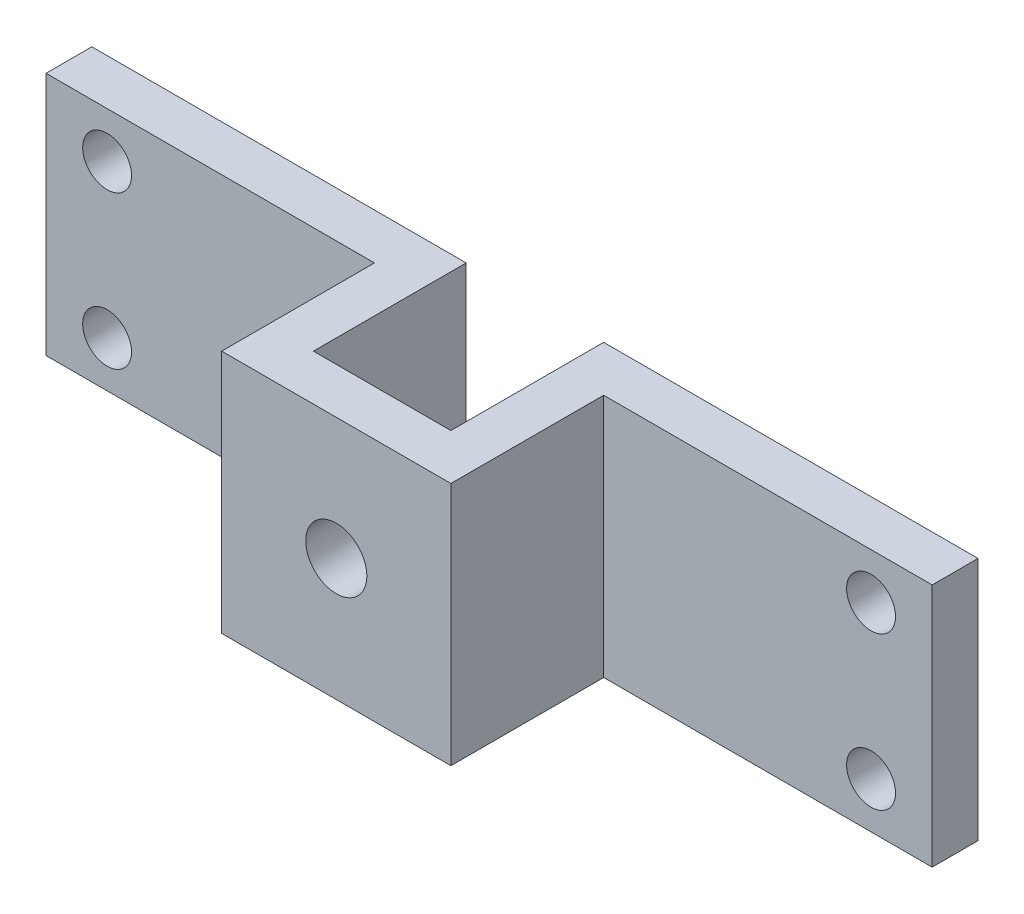
ISO-10303-21;
HEADER;
FILE_DESCRIPTION(('STEP AP214'),'2;1');
FILE_NAME('part.step','',(''),(''),'','','');
FILE_SCHEMA(('AUTOMOTIVE_DESIGN { 1 0 10303 214 1 1 1 1 }'));
ENDSEC;
DATA;
#1=APPLICATION_CONTEXT('core data for automotive mechanical design processes');
#2=APPLICATION_PROTOCOL_DEFINITION('international standard','automotive_design',2000,#1);
#3=PRODUCT_CONTEXT('',#1,'mechanical');
#4=PRODUCT('Part','Part','',(#3));
#5=PRODUCT_RELATED_PRODUCT_CATEGORY('part','',(#4));
#6=PRODUCT_DEFINITION_FORMATION('','',#4);
#7=PRODUCT_DEFINITION_CONTEXT('part definition',#1,'design');
#8=PRODUCT_DEFINITION('design','',#6,#7);
#9=PRODUCT_DEFINITION_SHAPE('','',#8);
#10=(LENGTH_UNIT() NAMED_UNIT(*) SI_UNIT(.MILLI.,.METRE.));
#11=(NAMED_UNIT(*) PLANE_ANGLE_UNIT() SI_UNIT($,.RADIAN.));
#12=(NAMED_UNIT(*) SI_UNIT($,.STERADIAN.) SOLID_ANGLE_UNIT());
#13=UNCERTAINTY_MEASURE_WITH_UNIT(LENGTH_MEASURE(1.E-05),#10,'distance_accuracy_value','');
#14=(GEOMETRIC_REPRESENTATION_CONTEXT(3) GLOBAL_UNCERTAINTY_ASSIGNED_CONTEXT((#13)) GLOBAL_UNIT_ASSIGNED_CONTEXT((#10,
#11,#12)) REPRESENTATION_CONTEXT('',''));
#15=CARTESIAN_POINT('',(0.,0.,0.));
#16=DIRECTION('',(0.,0.,1.));
#17=DIRECTION('',(1.,0.,0.));
#18=AXIS2_PLACEMENT_3D('',#15,#16,#17);
#19=CARTESIAN_POINT('',(0.,16.,3.));
#20=DIRECTION('',(1.,0.,0.));
#21=DIRECTION('',(0.,0.,-1.));
#22=AXIS2_PLACEMENT_3D('',#19,#20,#21);
#23=PLANE('',#22);
#24=DIRECTION('',(0.,0.,1.));
#25=VECTOR('',#24,1.);
#26=CARTESIAN_POINT('',(0.,0.,3.));
#27=LINE('',#26,#25);
#28=CARTESIAN_POINT('',(0.,0.,0.));
#29=VERTEX_POINT('',#28);
#30=CARTESIAN_POINT('',(0.,0.,3.));
#31=VERTEX_POINT('',#30);
#32=EDGE_CURVE('E157',#29,#31,#27,.T.);
#33=ORIENTED_EDGE('',*,*,#32,.T.);
#34=DIRECTION('',(0.,-1.,0.));
#35=VECTOR('',#34,1.);
#36=CARTESIAN_POINT('',(0.,16.,3.));
#37=LINE('',#36,#35);
#38=CARTESIAN_POINT('',(0.,16.,3.));
#39=VERTEX_POINT('',#38);
#40=EDGE_CURVE('E11',#39,#31,#37,.T.);
#41=ORIENTED_EDGE('',*,*,#40,.F.);
#42=DIRECTION('',(0.,0.,1.));
#43=VECTOR('',#42,1.);
#44=CARTESIAN_POINT('',(0.,16.,3.));
#45=LINE('',#44,#43);
#46=CARTESIAN_POINT('',(0.,16.,0.));
#47=VERTEX_POINT('',#46);
#48=EDGE_CURVE('E180',#47,#39,#45,.T.);
#49=ORIENTED_EDGE('',*,*,#48,.F.);
#50=DIRECTION('',(0.,-1.,0.));
#51=VECTOR('',#50,1.);
#52=CARTESIAN_POINT('',(0.,16.,0.));
#53=LINE('',#52,#51);
#54=EDGE_CURVE('E153',#47,#29,#53,.T.);
#55=ORIENTED_EDGE('',*,*,#54,.T.);
#56=EDGE_LOOP('',(#33,#41,#49,#55));
#57=FACE_BOUND('',#56,.T.);
#58=ADVANCED_FACE('F35',(#57),#23,.F.);
#59=CARTESIAN_POINT('',(21.5,16.,3.));
#60=DIRECTION('',(0.,0.,-1.));
#61=DIRECTION('',(-1.,0.,0.));
#62=AXIS2_PLACEMENT_3D('',#59,#60,#61);
#63=PLANE('',#62);
#64=CARTESIAN_POINT('',(4.,3.,3.));
#65=DIRECTION('',(0.,0.,-1.));
#66=DIRECTION('',(-1.,0.,0.));
#67=AXIS2_PLACEMENT_3D('',#64,#65,#66);
#68=CIRCLE('',#67,1.59996578956468);
#69=CARTESIAN_POINT('',(2.40003421043532,3.,3.));
#70=VERTEX_POINT('',#69);
#71=EDGE_CURVE('E212',#70,#70,#68,.T.);
#72=ORIENTED_EDGE('',*,*,#71,.T.);
#73=EDGE_LOOP('',(#72));
#74=FACE_BOUND('',#73,.T.);
#75=CARTESIAN_POINT('',(4.,13.,3.));
#76=DIRECTION('',(0.,0.,-1.));
#77=DIRECTION('',(-1.,0.,0.));
#78=AXIS2_PLACEMENT_3D('',#75,#76,#77);
#79=CIRCLE('',#78,1.59996578956469);
#80=CARTESIAN_POINT('',(2.40003421043531,13.,3.));
#81=VERTEX_POINT('',#80);
#82=EDGE_CURVE('E207',#81,#81,#79,.T.);
#83=ORIENTED_EDGE('',*,*,#82,.T.);
#84=EDGE_LOOP('',(#83));
#85=FACE_BOUND('',#84,.T.);
#86=DIRECTION('',(1.,0.,0.));
#87=VECTOR('',#86,1.);
#88=CARTESIAN_POINT('',(21.5,0.,3.));
#89=LINE('',#88,#87);
#90=CARTESIAN_POINT('',(21.5,0.,3.));
#91=VERTEX_POINT('',#90);
#92=EDGE_CURVE('E160',#31,#91,#89,.T.);
#93=ORIENTED_EDGE('',*,*,#92,.T.);
#94=DIRECTION('',(0.,-1.,0.));
#95=VECTOR('',#94,1.);
#96=CARTESIAN_POINT('',(21.5,16.,3.));
#97=LINE('',#96,#95);
#98=CARTESIAN_POINT('',(21.5,16.,3.));
#99=VERTEX_POINT('',#98);
#100=EDGE_CURVE('E44',#99,#91,#97,.T.);
#101=ORIENTED_EDGE('',*,*,#100,.F.);
#102=DIRECTION('',(1.,0.,0.));
#103=VECTOR('',#102,1.);
#104=CARTESIAN_POINT('',(21.5,16.,3.));
#105=LINE('',#104,#103);
#106=EDGE_CURVE('E108',#39,#99,#105,.T.);
#107=ORIENTED_EDGE('',*,*,#106,.F.);
#108=ORIENTED_EDGE('',*,*,#40,.T.);
#109=EDGE_LOOP('',(#93,#101,#107,#108));
#110=FACE_BOUND('',#109,.T.);
#111=ADVANCED_FACE('F273',(#74,#85,#110),#63,.F.);
#112=CARTESIAN_POINT('',(21.5,16.,13.));
#113=DIRECTION('',(1.,0.,0.));
#114=DIRECTION('',(0.,0.,-1.));
#115=AXIS2_PLACEMENT_3D('',#112,#113,#114);
#116=PLANE('',#115);
#117=DIRECTION('',(0.,0.,1.));
#118=VECTOR('',#117,1.);
#119=CARTESIAN_POINT('',(21.5,0.,13.));
#120=LINE('',#119,#118);
#121=CARTESIAN_POINT('',(21.5,0.,13.));
#122=VERTEX_POINT('',#121);
#123=EDGE_CURVE('E163',#91,#122,#120,.T.);
#124=ORIENTED_EDGE('',*,*,#123,.T.);
#125=DIRECTION('',(0.,-1.,0.));
#126=VECTOR('',#125,1.);
#127=CARTESIAN_POINT('',(21.5,16.,13.));
#128=LINE('',#127,#126);
#129=CARTESIAN_POINT('',(21.5,16.,13.));
#130=VERTEX_POINT('',#129);
#131=EDGE_CURVE('E199',#130,#122,#128,.T.);
#132=ORIENTED_EDGE('',*,*,#131,.F.);
#133=DIRECTION('',(0.,0.,1.));
#134=VECTOR('',#133,1.);
#135=CARTESIAN_POINT('',(21.5,16.,13.));
#136=LINE('',#135,#134);
#137=EDGE_CURVE('E232',#99,#130,#136,.T.);
#138=ORIENTED_EDGE('',*,*,#137,.F.);
#139=ORIENTED_EDGE('',*,*,#100,.T.);
#140=EDGE_LOOP('',(#124,#132,#138,#139));
#141=FACE_BOUND('',#140,.T.);
#142=ADVANCED_FACE('F277',(#141),#116,.F.);
#143=CARTESIAN_POINT('',(36.5,16.,13.));
#144=DIRECTION('',(0.,0.,-1.));
#145=DIRECTION('',(-1.,0.,0.));
#146=AXIS2_PLACEMENT_3D('',#143,#144,#145);
#147=PLANE('',#146);
#148=CARTESIAN_POINT('',(29.,8.,13.));
#149=DIRECTION('',(0.,0.,1.));
#150=DIRECTION('',(1.,0.,0.));
#151=AXIS2_PLACEMENT_3D('',#148,#149,#150);
#152=CIRCLE('',#151,2.);
#153=CARTESIAN_POINT('',(31.,8.,13.));
#154=VERTEX_POINT('',#153);
#155=EDGE_CURVE('E208',#154,#154,#152,.T.);
#156=ORIENTED_EDGE('',*,*,#155,.F.);
#157=EDGE_LOOP('',(#156));
#158=FACE_BOUND('',#157,.T.);
#159=DIRECTION('',(1.,0.,0.));
#160=VECTOR('',#159,1.);
#161=CARTESIAN_POINT('',(36.5,0.,13.));
#162=LINE('',#161,#160);
#163=CARTESIAN_POINT('',(36.5,0.,13.));
#164=VERTEX_POINT('',#163);
#165=EDGE_CURVE('E165',#122,#164,#162,.T.);
#166=ORIENTED_EDGE('',*,*,#165,.T.);
#167=DIRECTION('',(0.,-1.,0.));
#168=VECTOR('',#167,1.);
#169=CARTESIAN_POINT('',(36.5,16.,13.));
#170=LINE('',#169,#168);
#171=CARTESIAN_POINT('',(36.5,16.,13.));
#172=VERTEX_POINT('',#171);
#173=EDGE_CURVE('E196',#172,#164,#170,.T.);
#174=ORIENTED_EDGE('',*,*,#173,.F.);
#175=DIRECTION('',(1.,0.,0.));
#176=VECTOR('',#175,1.);
#177=CARTESIAN_POINT('',(36.5,16.,13.));
#178=LINE('',#177,#176);
#179=EDGE_CURVE('E234',#130,#172,#178,.T.);
#180=ORIENTED_EDGE('',*,*,#179,.F.);
#181=ORIENTED_EDGE('',*,*,#131,.T.);
#182=EDGE_LOOP('',(#166,#174,#180,#181));
#183=FACE_BOUND('',#182,.T.);
#184=ADVANCED_FACE('F282',(#158,#183),#147,.F.);
#185=CARTESIAN_POINT('',(36.5,16.,3.));
#186=DIRECTION('',(-1.,0.,0.));
#187=DIRECTION('',(0.,0.,1.));
#188=AXIS2_PLACEMENT_3D('',#185,#186,#187);
#189=PLANE('',#188);
#190=DIRECTION('',(0.,0.,-1.));
#191=VECTOR('',#190,1.);
#192=CARTESIAN_POINT('',(36.5,0.,3.));
#193=LINE('',#192,#191);
#194=CARTESIAN_POINT('',(36.5,0.,3.));
#195=VERTEX_POINT('',#194);
#196=EDGE_CURVE('E167',#164,#195,#193,.T.);
#197=ORIENTED_EDGE('',*,*,#196,.T.);
#198=DIRECTION('',(0.,-1.,0.));
#199=VECTOR('',#198,1.);
#200=CARTESIAN_POINT('',(36.5,16.,3.));
#201=LINE('',#200,#199);
#202=CARTESIAN_POINT('',(36.5,16.,3.));
#203=VERTEX_POINT('',#202);
#204=EDGE_CURVE('E193',#203,#195,#201,.T.);
#205=ORIENTED_EDGE('',*,*,#204,.F.);
#206=DIRECTION('',(0.,0.,-1.));
#207=VECTOR('',#206,1.);
#208=CARTESIAN_POINT('',(36.5,16.,3.));
#209=LINE('',#208,#207);
#210=EDGE_CURVE('E236',#172,#203,#209,.T.);
#211=ORIENTED_EDGE('',*,*,#210,.F.);
#212=ORIENTED_EDGE('',*,*,#173,.T.);
#213=EDGE_LOOP('',(#197,#205,#211,#212));
#214=FACE_BOUND('',#213,.T.);
#215=ADVANCED_FACE('F290',(#214),#189,.F.);
#216=CARTESIAN_POINT('',(58.,16.,3.));
#217=DIRECTION('',(0.,0.,-1.));
#218=DIRECTION('',(-1.,0.,0.));
#219=AXIS2_PLACEMENT_3D('',#216,#217,#218);
#220=PLANE('',#219);
#221=CARTESIAN_POINT('',(54.,3.,3.));
#222=DIRECTION('',(0.,0.,-1.));
#223=DIRECTION('',(-1.,0.,0.));
#224=AXIS2_PLACEMENT_3D('',#221,#222,#223);
#225=CIRCLE('',#224,1.59996578956469);
#226=CARTESIAN_POINT('',(52.4000342104353,3.,3.));
#227=VERTEX_POINT('',#226);
#228=EDGE_CURVE('E161',#227,#227,#225,.T.);
#229=ORIENTED_EDGE('',*,*,#228,.T.);
#230=EDGE_LOOP('',(#229));
#231=FACE_BOUND('',#230,.T.);
#232=CARTESIAN_POINT('',(54.,13.,3.));
#233=DIRECTION('',(0.,0.,-1.));
#234=DIRECTION('',(-1.,0.,0.));
#235=AXIS2_PLACEMENT_3D('',#232,#233,#234);
#236=CIRCLE('',#235,1.59996578956469);
#237=CARTESIAN_POINT('',(52.4000342104353,13.,3.));
#238=VERTEX_POINT('',#237);
#239=EDGE_CURVE('E217',#238,#238,#236,.T.);
#240=ORIENTED_EDGE('',*,*,#239,.T.);
#241=EDGE_LOOP('',(#240));
#242=FACE_BOUND('',#241,.T.);
#243=DIRECTION('',(1.,0.,0.));
#244=VECTOR('',#243,1.);
#245=CARTESIAN_POINT('',(58.,0.,3.));
#246=LINE('',#245,#244);
#247=CARTESIAN_POINT('',(58.,0.,3.));
#248=VERTEX_POINT('',#247);
#249=EDGE_CURVE('E169',#195,#248,#246,.T.);
#250=ORIENTED_EDGE('',*,*,#249,.T.);
#251=DIRECTION('',(0.,-1.,0.));
#252=VECTOR('',#251,1.);
#253=CARTESIAN_POINT('',(58.,16.,3.));
#254=LINE('',#253,#252);
#255=CARTESIAN_POINT('',(58.,16.,3.));
#256=VERTEX_POINT('',#255);
#257=EDGE_CURVE('E190',#256,#248,#254,.T.);
#258=ORIENTED_EDGE('',*,*,#257,.F.);
#259=DIRECTION('',(1.,0.,0.));
#260=VECTOR('',#259,1.);
#261=CARTESIAN_POINT('',(58.,16.,3.));
#262=LINE('',#261,#260);
#263=EDGE_CURVE('E238',#203,#256,#262,.T.);
#264=ORIENTED_EDGE('',*,*,#263,.F.);
#265=ORIENTED_EDGE('',*,*,#204,.T.);
#266=EDGE_LOOP('',(#250,#258,#264,#265));
#267=FACE_BOUND('',#266,.T.);
#268=ADVANCED_FACE('F294',(#231,#242,#267),#220,.F.);
#269=CARTESIAN_POINT('',(58.,16.,0.));
#270=DIRECTION('',(-1.,0.,0.));
#271=DIRECTION('',(0.,0.,1.));
#272=AXIS2_PLACEMENT_3D('',#269,#270,#271);
#273=PLANE('',#272);
#274=DIRECTION('',(0.,0.,-1.));
#275=VECTOR('',#274,1.);
#276=CARTESIAN_POINT('',(58.,0.,0.));
#277=LINE('',#276,#275);
#278=CARTESIAN_POINT('',(58.,0.,0.));
#279=VERTEX_POINT('',#278);
#280=EDGE_CURVE('E171',#248,#279,#277,.T.);
#281=ORIENTED_EDGE('',*,*,#280,.T.);
#282=DIRECTION('',(0.,-1.,0.));
#283=VECTOR('',#282,1.);
#284=CARTESIAN_POINT('',(58.,16.,0.));
#285=LINE('',#284,#283);
#286=CARTESIAN_POINT('',(58.,16.,0.));
#287=VERTEX_POINT('',#286);
#288=EDGE_CURVE('E187',#287,#279,#285,.T.);
#289=ORIENTED_EDGE('',*,*,#288,.F.);
#290=DIRECTION('',(0.,0.,-1.));
#291=VECTOR('',#290,1.);
#292=CARTESIAN_POINT('',(58.,16.,0.));
#293=LINE('',#292,#291);
#294=EDGE_CURVE('E240',#256,#287,#293,.T.);
#295=ORIENTED_EDGE('',*,*,#294,.F.);
#296=ORIENTED_EDGE('',*,*,#257,.T.);
#297=EDGE_LOOP('',(#281,#289,#295,#296));
#298=FACE_BOUND('',#297,.T.);
#299=ADVANCED_FACE('F298',(#298),#273,.F.);
#300=CARTESIAN_POINT('',(33.5,16.,0.));
#301=DIRECTION('',(0.,0.,1.));
#302=DIRECTION('',(1.,0.,0.));
#303=AXIS2_PLACEMENT_3D('',#300,#301,#302);
#304=PLANE('',#303);
#305=CARTESIAN_POINT('',(54.,3.,0.));
#306=DIRECTION('',(0.,0.,1.));
#307=DIRECTION('',(1.,0.,0.));
#308=AXIS2_PLACEMENT_3D('',#305,#306,#307);
#309=CIRCLE('',#308,1.59996578956469);
#310=CARTESIAN_POINT('',(55.5999657895647,3.,0.));
#311=VERTEX_POINT('',#310);
#312=EDGE_CURVE('E38',#311,#311,#309,.T.);
#313=ORIENTED_EDGE('',*,*,#312,.T.);
#314=EDGE_LOOP('',(#313));
#315=FACE_BOUND('',#314,.T.);
#316=CARTESIAN_POINT('',(54.,13.,0.));
#317=DIRECTION('',(0.,0.,1.));
#318=DIRECTION('',(1.,0.,0.));
#319=AXIS2_PLACEMENT_3D('',#316,#317,#318);
#320=CIRCLE('',#319,1.59996578956469);
#321=CARTESIAN_POINT('',(55.5999657895647,13.,0.));
#322=VERTEX_POINT('',#321);
#323=EDGE_CURVE('E215',#322,#322,#320,.T.);
#324=ORIENTED_EDGE('',*,*,#323,.T.);
#325=EDGE_LOOP('',(#324));
#326=FACE_BOUND('',#325,.T.);
#327=DIRECTION('',(-1.,0.,0.));
#328=VECTOR('',#327,1.);
#329=CARTESIAN_POINT('',(33.5,0.,0.));
#330=LINE('',#329,#328);
#331=CARTESIAN_POINT('',(33.5,0.,0.));
#332=VERTEX_POINT('',#331);
#333=EDGE_CURVE('E173',#279,#332,#330,.T.);
#334=ORIENTED_EDGE('',*,*,#333,.T.);
#335=DIRECTION('',(0.,-1.,0.));
#336=VECTOR('',#335,1.);
#337=CARTESIAN_POINT('',(33.5,16.,0.));
#338=LINE('',#337,#336);
#339=CARTESIAN_POINT('',(33.5,16.,0.));
#340=VERTEX_POINT('',#339);
#341=EDGE_CURVE('E184',#340,#332,#338,.T.);
#342=ORIENTED_EDGE('',*,*,#341,.F.);
#343=DIRECTION('',(-1.,0.,0.));
#344=VECTOR('',#343,1.);
#345=CARTESIAN_POINT('',(33.5,16.,0.));
#346=LINE('',#345,#344);
#347=EDGE_CURVE('E242',#287,#340,#346,.T.);
#348=ORIENTED_EDGE('',*,*,#347,.F.);
#349=ORIENTED_EDGE('',*,*,#288,.T.);
#350=EDGE_LOOP('',(#334,#342,#348,#349));
#351=FACE_BOUND('',#350,.T.);
#352=ADVANCED_FACE('F248',(#315,#326,#351),#304,.F.);
#353=CARTESIAN_POINT('',(33.5,16.,10.));
#354=DIRECTION('',(1.,0.,0.));
#355=DIRECTION('',(0.,0.,-1.));
#356=AXIS2_PLACEMENT_3D('',#353,#354,#355);
#357=PLANE('',#356);
#358=DIRECTION('',(0.,0.,1.));
#359=VECTOR('',#358,1.);
#360=CARTESIAN_POINT('',(33.5,0.,10.));
#361=LINE('',#360,#359);
#362=CARTESIAN_POINT('',(33.5,0.,10.));
#363=VERTEX_POINT('',#362);
#364=EDGE_CURVE('E175',#332,#363,#361,.T.);
#365=ORIENTED_EDGE('',*,*,#364,.T.);
#366=DIRECTION('',(0.,-1.,0.));
#367=VECTOR('',#366,1.);
#368=CARTESIAN_POINT('',(33.5,16.,10.));
#369=LINE('',#368,#367);
#370=CARTESIAN_POINT('',(33.5,16.,10.));
#371=VERTEX_POINT('',#370);
#372=EDGE_CURVE('E148',#371,#363,#369,.T.);
#373=ORIENTED_EDGE('',*,*,#372,.F.);
#374=DIRECTION('',(0.,0.,1.));
#375=VECTOR('',#374,1.);
#376=CARTESIAN_POINT('',(33.5,16.,10.));
#377=LINE('',#376,#375);
#378=EDGE_CURVE('E139',#340,#371,#377,.T.);
#379=ORIENTED_EDGE('',*,*,#378,.F.);
#380=ORIENTED_EDGE('',*,*,#341,.T.);
#381=EDGE_LOOP('',(#365,#373,#379,#380));
#382=FACE_BOUND('',#381,.T.);
#383=ADVANCED_FACE('F252',(#382),#357,.F.);
#384=CARTESIAN_POINT('',(24.5,16.,10.));
#385=DIRECTION('',(0.,0.,1.));
#386=DIRECTION('',(1.,0.,0.));
#387=AXIS2_PLACEMENT_3D('',#384,#385,#386);
#388=PLANE('',#387);
#389=CARTESIAN_POINT('',(29.,8.,10.));
#390=DIRECTION('',(0.,0.,1.));
#391=DIRECTION('',(1.,0.,0.));
#392=AXIS2_PLACEMENT_3D('',#389,#390,#391);
#393=CIRCLE('',#392,2.);
#394=CARTESIAN_POINT('',(31.,8.,10.));
#395=VERTEX_POINT('',#394);
#396=EDGE_CURVE('E213',#395,#395,#393,.T.);
#397=ORIENTED_EDGE('',*,*,#396,.T.);
#398=EDGE_LOOP('',(#397));
#399=FACE_BOUND('',#398,.T.);
#400=DIRECTION('',(-1.,0.,0.));
#401=VECTOR('',#400,1.);
#402=CARTESIAN_POINT('',(24.5,0.,10.));
#403=LINE('',#402,#401);
#404=CARTESIAN_POINT('',(24.5,0.,10.));
#405=VERTEX_POINT('',#404);
#406=EDGE_CURVE('E147',#363,#405,#403,.T.);
#407=ORIENTED_EDGE('',*,*,#406,.T.);
#408=DIRECTION('',(0.,-1.,0.));
#409=VECTOR('',#408,1.);
#410=CARTESIAN_POINT('',(24.5,16.,10.));
#411=LINE('',#410,#409);
#412=CARTESIAN_POINT('',(24.5,16.,10.));
#413=VERTEX_POINT('',#412);
#414=EDGE_CURVE('E144',#413,#405,#411,.T.);
#415=ORIENTED_EDGE('',*,*,#414,.F.);
#416=DIRECTION('',(-1.,0.,0.));
#417=VECTOR('',#416,1.);
#418=CARTESIAN_POINT('',(24.5,16.,10.));
#419=LINE('',#418,#417);
#420=EDGE_CURVE('E133',#371,#413,#419,.T.);
#421=ORIENTED_EDGE('',*,*,#420,.F.);
#422=ORIENTED_EDGE('',*,*,#372,.T.);
#423=EDGE_LOOP('',(#407,#415,#421,#422));
#424=FACE_BOUND('',#423,.T.);
#425=ADVANCED_FACE('F145',(#399,#424),#388,.F.);
#426=CARTESIAN_POINT('',(24.5,16.,0.));
#427=DIRECTION('',(-1.,0.,0.));
#428=DIRECTION('',(0.,0.,1.));
#429=AXIS2_PLACEMENT_3D('',#426,#427,#428);
#430=PLANE('',#429);
#431=DIRECTION('',(0.,0.,-1.));
#432=VECTOR('',#431,1.);
#433=CARTESIAN_POINT('',(24.5,0.,0.));
#434=LINE('',#433,#432);
#435=CARTESIAN_POINT('',(24.5,0.,0.));
#436=VERTEX_POINT('',#435);
#437=EDGE_CURVE('E94',#405,#436,#434,.T.);
#438=ORIENTED_EDGE('',*,*,#437,.T.);
#439=DIRECTION('',(0.,-1.,0.));
#440=VECTOR('',#439,1.);
#441=CARTESIAN_POINT('',(24.5,16.,0.));
#442=LINE('',#441,#440);
#443=CARTESIAN_POINT('',(24.5,16.,0.));
#444=VERTEX_POINT('',#443);
#445=EDGE_CURVE('E149',#444,#436,#442,.T.);
#446=ORIENTED_EDGE('',*,*,#445,.F.);
#447=DIRECTION('',(0.,0.,-1.));
#448=VECTOR('',#447,1.);
#449=CARTESIAN_POINT('',(24.5,16.,0.));
#450=LINE('',#449,#448);
#451=EDGE_CURVE('E137',#413,#444,#450,.T.);
#452=ORIENTED_EDGE('',*,*,#451,.F.);
#453=ORIENTED_EDGE('',*,*,#414,.T.);
#454=EDGE_LOOP('',(#438,#446,#452,#453));
#455=FACE_BOUND('',#454,.T.);
#456=ADVANCED_FACE('F151',(#455),#430,.F.);
#457=CARTESIAN_POINT('',(0.,16.,0.));
#458=DIRECTION('',(0.,0.,1.));
#459=DIRECTION('',(1.,0.,0.));
#460=AXIS2_PLACEMENT_3D('',#457,#458,#459);
#461=PLANE('',#460);
#462=CARTESIAN_POINT('',(4.,3.,0.));
#463=DIRECTION('',(0.,0.,1.));
#464=DIRECTION('',(1.,0.,0.));
#465=AXIS2_PLACEMENT_3D('',#462,#463,#464);
#466=CIRCLE('',#465,1.59996578956468);
#467=CARTESIAN_POINT('',(5.59996578956468,3.,0.));
#468=VERTEX_POINT('',#467);
#469=EDGE_CURVE('E209',#468,#468,#466,.T.);
#470=ORIENTED_EDGE('',*,*,#469,.T.);
#471=EDGE_LOOP('',(#470));
#472=FACE_BOUND('',#471,.T.);
#473=CARTESIAN_POINT('',(4.,13.,0.));
#474=DIRECTION('',(0.,0.,1.));
#475=DIRECTION('',(1.,0.,0.));
#476=AXIS2_PLACEMENT_3D('',#473,#474,#475);
#477=CIRCLE('',#476,1.59996578956469);
#478=CARTESIAN_POINT('',(5.59996578956469,13.,0.));
#479=VERTEX_POINT('',#478);
#480=EDGE_CURVE('E204',#479,#479,#477,.T.);
#481=ORIENTED_EDGE('',*,*,#480,.T.);
#482=EDGE_LOOP('',(#481));
#483=FACE_BOUND('',#482,.T.);
#484=DIRECTION('',(-1.,0.,0.));
#485=VECTOR('',#484,1.);
#486=CARTESIAN_POINT('',(0.,0.,0.));
#487=LINE('',#486,#485);
#488=EDGE_CURVE('E100',#436,#29,#487,.T.);
#489=ORIENTED_EDGE('',*,*,#488,.T.);
#490=ORIENTED_EDGE('',*,*,#54,.F.);
#491=DIRECTION('',(-1.,0.,0.));
#492=VECTOR('',#491,1.);
#493=CARTESIAN_POINT('',(0.,16.,0.));
#494=LINE('',#493,#492);
#495=EDGE_CURVE('E53',#444,#47,#494,.T.);
#496=ORIENTED_EDGE('',*,*,#495,.F.);
#497=ORIENTED_EDGE('',*,*,#445,.T.);
#498=EDGE_LOOP('',(#489,#490,#496,#497));
#499=FACE_BOUND('',#498,.T.);
#500=ADVANCED_FACE('F260',(#472,#483,#499),#461,.F.);
#501=CARTESIAN_POINT('',(0.,16.,0.));
#502=DIRECTION('',(0.,-1.,0.));
#503=DIRECTION('',(0.,0.,-1.));
#504=AXIS2_PLACEMENT_3D('',#501,#502,#503);
#505=PLANE('',#504);
#506=ORIENTED_EDGE('',*,*,#48,.T.);
#507=ORIENTED_EDGE('',*,*,#106,.T.);
#508=ORIENTED_EDGE('',*,*,#137,.T.);
#509=ORIENTED_EDGE('',*,*,#179,.T.);
#510=ORIENTED_EDGE('',*,*,#210,.T.);
#511=ORIENTED_EDGE('',*,*,#263,.T.);
#512=ORIENTED_EDGE('',*,*,#294,.T.);
#513=ORIENTED_EDGE('',*,*,#347,.T.);
#514=ORIENTED_EDGE('',*,*,#378,.T.);
#515=ORIENTED_EDGE('',*,*,#420,.T.);
#516=ORIENTED_EDGE('',*,*,#451,.T.);
#517=ORIENTED_EDGE('',*,*,#495,.T.);
#518=EDGE_LOOP('',(#506,#507,#508,#509,#510,#511,#512,#513,#514,#515,#516,#517));
#519=FACE_BOUND('',#518,.T.);
#520=ADVANCED_FACE('F135',(#519),#505,.F.);
#521=CARTESIAN_POINT('',(0.,0.,0.));
#522=DIRECTION('',(0.,-1.,0.));
#523=DIRECTION('',(0.,0.,-1.));
#524=AXIS2_PLACEMENT_3D('',#521,#522,#523);
#525=PLANE('',#524);
#526=ORIENTED_EDGE('',*,*,#32,.F.);
#527=ORIENTED_EDGE('',*,*,#488,.F.);
#528=ORIENTED_EDGE('',*,*,#437,.F.);
#529=ORIENTED_EDGE('',*,*,#406,.F.);
#530=ORIENTED_EDGE('',*,*,#364,.F.);
#531=ORIENTED_EDGE('',*,*,#333,.F.);
#532=ORIENTED_EDGE('',*,*,#280,.F.);
#533=ORIENTED_EDGE('',*,*,#249,.F.);
#534=ORIENTED_EDGE('',*,*,#196,.F.);
#535=ORIENTED_EDGE('',*,*,#165,.F.);
#536=ORIENTED_EDGE('',*,*,#123,.F.);
#537=ORIENTED_EDGE('',*,*,#92,.F.);
#538=EDGE_LOOP('',(#526,#527,#528,#529,#530,#531,#532,#533,#534,#535,#536,#537));
#539=FACE_BOUND('',#538,.T.);
#540=ADVANCED_FACE('F255',(#539),#525,.T.);
#541=CARTESIAN_POINT('',(4.,13.,-3.));
#542=DIRECTION('',(0.,0.,1.));
#543=DIRECTION('',(1.,0.,0.));
#544=AXIS2_PLACEMENT_3D('',#541,#542,#543);
#545=CYLINDRICAL_SURFACE('',#544,1.59996578956469);
#546=ORIENTED_EDGE('',*,*,#480,.F.);
#547=EDGE_LOOP('',(#546));
#548=FACE_BOUND('',#547,.T.);
#549=ORIENTED_EDGE('',*,*,#82,.F.);
#550=EDGE_LOOP('',(#549));
#551=FACE_BOUND('',#550,.T.);
#552=ADVANCED_FACE('F327',(#548,#551),#545,.F.);
#553=CARTESIAN_POINT('',(4.,3.,-3.));
#554=DIRECTION('',(0.,0.,1.));
#555=DIRECTION('',(1.,0.,0.));
#556=AXIS2_PLACEMENT_3D('',#553,#554,#555);
#557=CYLINDRICAL_SURFACE('',#556,1.59996578956468);
#558=ORIENTED_EDGE('',*,*,#469,.F.);
#559=EDGE_LOOP('',(#558));
#560=FACE_BOUND('',#559,.T.);
#561=ORIENTED_EDGE('',*,*,#71,.F.);
#562=EDGE_LOOP('',(#561));
#563=FACE_BOUND('',#562,.T.);
#564=ADVANCED_FACE('F317',(#560,#563),#557,.F.);
#565=CARTESIAN_POINT('',(29.,8.,-3.));
#566=DIRECTION('',(0.,0.,1.));
#567=DIRECTION('',(1.,0.,0.));
#568=AXIS2_PLACEMENT_3D('',#565,#566,#567);
#569=CYLINDRICAL_SURFACE('',#568,2.);
#570=ORIENTED_EDGE('',*,*,#155,.T.);
#571=EDGE_LOOP('',(#570));
#572=FACE_BOUND('',#571,.T.);
#573=ORIENTED_EDGE('',*,*,#396,.F.);
#574=EDGE_LOOP('',(#573));
#575=FACE_BOUND('',#574,.T.);
#576=ADVANCED_FACE('F314',(#572,#575),#569,.F.);
#577=CARTESIAN_POINT('',(54.,13.,-3.));
#578=DIRECTION('',(0.,0.,1.));
#579=DIRECTION('',(1.,0.,0.));
#580=AXIS2_PLACEMENT_3D('',#577,#578,#579);
#581=CYLINDRICAL_SURFACE('',#580,1.59996578956469);
#582=ORIENTED_EDGE('',*,*,#323,.F.);
#583=EDGE_LOOP('',(#582));
#584=FACE_BOUND('',#583,.T.);
#585=ORIENTED_EDGE('',*,*,#239,.F.);
#586=EDGE_LOOP('',(#585));
#587=FACE_BOUND('',#586,.T.);
#588=ADVANCED_FACE('F316',(#584,#587),#581,.F.);
#589=CARTESIAN_POINT('',(54.,3.,-3.));
#590=DIRECTION('',(0.,0.,1.));
#591=DIRECTION('',(1.,0.,0.));
#592=AXIS2_PLACEMENT_3D('',#589,#590,#591);
#593=CYLINDRICAL_SURFACE('',#592,1.59996578956469);
#594=ORIENTED_EDGE('',*,*,#312,.F.);
#595=EDGE_LOOP('',(#594));
#596=FACE_BOUND('',#595,.T.);
#597=ORIENTED_EDGE('',*,*,#228,.F.);
#598=EDGE_LOOP('',(#597));
#599=FACE_BOUND('',#598,.T.);
#600=ADVANCED_FACE('F324',(#596,#599),#593,.F.);
#601=CLOSED_SHELL('',(#58,#111,#142,#184,#215,#268,#299,#352,#383,#425,#456,#500,#520,#540,#552,
#564,#576,#588,#600));
#602=MANIFOLD_SOLID_BREP('B2',#601);
#603=ADVANCED_BREP_SHAPE_REPRESENTATION('',(#18,#602),#14);
#604=SHAPE_DEFINITION_REPRESENTATION(#9,#603);
ENDSEC;
END-ISO-10303-21;
